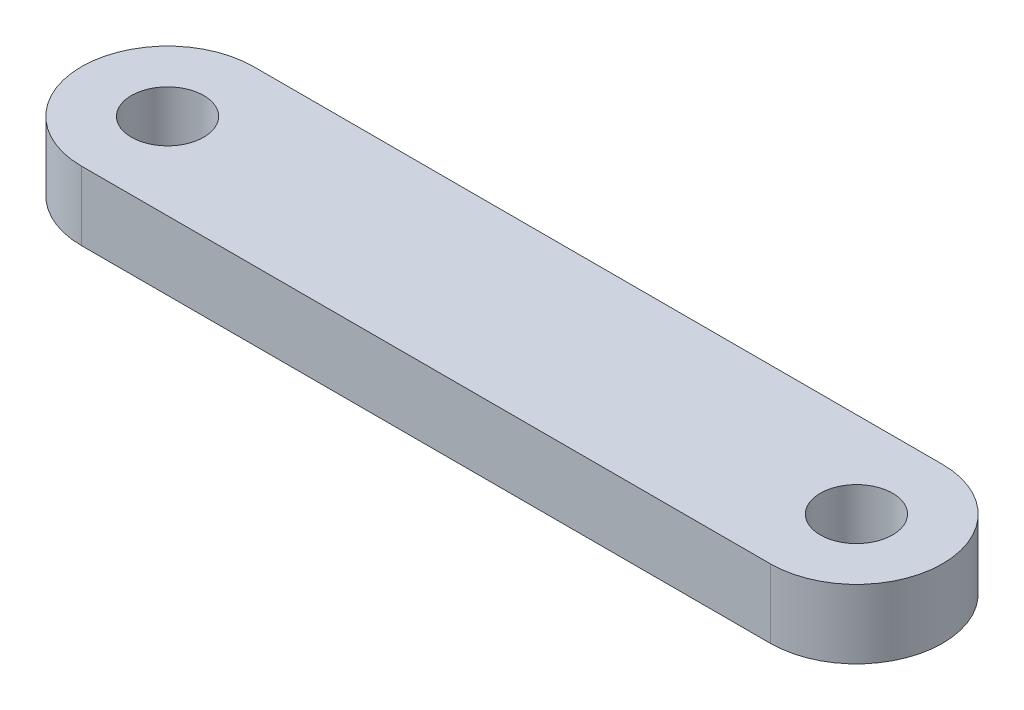
ISO-10303-21;
HEADER;
FILE_DESCRIPTION(('STEP AP214'),'2;1');
FILE_NAME('part.step','',(''),(''),'','','');
FILE_SCHEMA(('AUTOMOTIVE_DESIGN { 1 0 10303 214 1 1 1 1 }'));
ENDSEC;
DATA;
#1=APPLICATION_CONTEXT('core data for automotive mechanical design processes');
#2=APPLICATION_PROTOCOL_DEFINITION('international standard','automotive_design',2000,#1);
#3=PRODUCT_CONTEXT('',#1,'mechanical');
#4=PRODUCT('Part','Part','',(#3));
#5=PRODUCT_RELATED_PRODUCT_CATEGORY('part','',(#4));
#6=PRODUCT_DEFINITION_FORMATION('','',#4);
#7=PRODUCT_DEFINITION_CONTEXT('part definition',#1,'design');
#8=PRODUCT_DEFINITION('design','',#6,#7);
#9=PRODUCT_DEFINITION_SHAPE('','',#8);
#10=(LENGTH_UNIT() NAMED_UNIT(*) SI_UNIT(.MILLI.,.METRE.));
#11=(NAMED_UNIT(*) PLANE_ANGLE_UNIT() SI_UNIT($,.RADIAN.));
#12=(NAMED_UNIT(*) SI_UNIT($,.STERADIAN.) SOLID_ANGLE_UNIT());
#13=UNCERTAINTY_MEASURE_WITH_UNIT(LENGTH_MEASURE(1.E-05),#10,'distance_accuracy_value','');
#14=(GEOMETRIC_REPRESENTATION_CONTEXT(3) GLOBAL_UNCERTAINTY_ASSIGNED_CONTEXT((#13)) GLOBAL_UNIT_ASSIGNED_CONTEXT((#10,
#11,#12)) REPRESENTATION_CONTEXT('',''));
#15=CARTESIAN_POINT('',(0.,0.,0.));
#16=DIRECTION('',(0.,0.,1.));
#17=DIRECTION('',(1.,0.,0.));
#18=AXIS2_PLACEMENT_3D('',#15,#16,#17);
#19=CARTESIAN_POINT('',(0.,2.,0.));
#20=DIRECTION('',(0.,1.,0.));
#21=DIRECTION('',(0.,0.,1.));
#22=AXIS2_PLACEMENT_3D('',#19,#20,#21);
#23=PLANE('',#22);
#24=CARTESIAN_POINT('',(0.,2.,0.));
#25=DIRECTION('',(0.,1.,0.));
#26=DIRECTION('',(0.,0.,1.));
#27=AXIS2_PLACEMENT_3D('',#24,#25,#26);
#28=CIRCLE('',#27,1.05);
#29=CARTESIAN_POINT('',(0.,2.,1.05));
#30=VERTEX_POINT('',#29);
#31=EDGE_CURVE('E104',#30,#30,#28,.T.);
#32=ORIENTED_EDGE('',*,*,#31,.F.);
#33=EDGE_LOOP('',(#32));
#34=FACE_BOUND('',#33,.T.);
#35=CARTESIAN_POINT('',(0.,2.,0.));
#36=DIRECTION('',(0.,1.,0.));
#37=DIRECTION('',(0.,0.,1.));
#38=AXIS2_PLACEMENT_3D('',#35,#36,#37);
#39=CIRCLE('',#38,2.5);
#40=CARTESIAN_POINT('',(0.,2.,-2.5));
#41=VERTEX_POINT('',#40);
#42=CARTESIAN_POINT('',(0.,2.,2.5));
#43=VERTEX_POINT('',#42);
#44=EDGE_CURVE('E89',#41,#43,#39,.T.);
#45=ORIENTED_EDGE('',*,*,#44,.T.);
#46=DIRECTION('',(1.,0.,0.));
#47=VECTOR('',#46,1.);
#48=CARTESIAN_POINT('',(0.,2.,2.5));
#49=LINE('',#48,#47);
#50=CARTESIAN_POINT('',(20.,2.,2.5));
#51=VERTEX_POINT('',#50);
#52=EDGE_CURVE('E84',#43,#51,#49,.T.);
#53=ORIENTED_EDGE('',*,*,#52,.T.);
#54=CARTESIAN_POINT('',(20.,2.,0.));
#55=DIRECTION('',(0.,1.,0.));
#56=DIRECTION('',(0.,0.,1.));
#57=AXIS2_PLACEMENT_3D('',#54,#55,#56);
#58=CIRCLE('',#57,2.5);
#59=CARTESIAN_POINT('',(20.,2.,-2.5));
#60=VERTEX_POINT('',#59);
#61=EDGE_CURVE('E87',#51,#60,#58,.T.);
#62=ORIENTED_EDGE('',*,*,#61,.T.);
#63=DIRECTION('',(-1.,0.,0.));
#64=VECTOR('',#63,1.);
#65=CARTESIAN_POINT('',(0.,2.,-2.5));
#66=LINE('',#65,#64);
#67=EDGE_CURVE('E54',#60,#41,#66,.T.);
#68=ORIENTED_EDGE('',*,*,#67,.T.);
#69=EDGE_LOOP('',(#45,#53,#62,#68));
#70=FACE_BOUND('',#69,.T.);
#71=CARTESIAN_POINT('',(20.,2.,0.));
#72=DIRECTION('',(0.,1.,0.));
#73=DIRECTION('',(0.,0.,1.));
#74=AXIS2_PLACEMENT_3D('',#71,#72,#73);
#75=CIRCLE('',#74,1.05);
#76=CARTESIAN_POINT('',(20.,2.,1.05));
#77=VERTEX_POINT('',#76);
#78=EDGE_CURVE('E119',#77,#77,#75,.T.);
#79=ORIENTED_EDGE('',*,*,#78,.F.);
#80=EDGE_LOOP('',(#79));
#81=FACE_BOUND('',#80,.T.);
#82=ADVANCED_FACE('F37',(#34,#70,#81),#23,.T.);
#83=CARTESIAN_POINT('',(0.,0.,0.));
#84=DIRECTION('',(0.,1.,0.));
#85=DIRECTION('',(0.,0.,1.));
#86=AXIS2_PLACEMENT_3D('',#83,#84,#85);
#87=PLANE('',#86);
#88=CARTESIAN_POINT('',(0.,0.,0.));
#89=DIRECTION('',(0.,1.,0.));
#90=DIRECTION('',(0.,0.,1.));
#91=AXIS2_PLACEMENT_3D('',#88,#89,#90);
#92=CIRCLE('',#91,2.5);
#93=CARTESIAN_POINT('',(0.,0.,-2.5));
#94=VERTEX_POINT('',#93);
#95=CARTESIAN_POINT('',(0.,0.,2.5));
#96=VERTEX_POINT('',#95);
#97=EDGE_CURVE('E101',#94,#96,#92,.T.);
#98=ORIENTED_EDGE('',*,*,#97,.F.);
#99=DIRECTION('',(-1.,0.,0.));
#100=VECTOR('',#99,1.);
#101=CARTESIAN_POINT('',(0.,0.,-2.5));
#102=LINE('',#101,#100);
#103=CARTESIAN_POINT('',(20.,0.,-2.5));
#104=VERTEX_POINT('',#103);
#105=EDGE_CURVE('E77',#104,#94,#102,.T.);
#106=ORIENTED_EDGE('',*,*,#105,.F.);
#107=CARTESIAN_POINT('',(20.,0.,0.));
#108=DIRECTION('',(0.,1.,0.));
#109=DIRECTION('',(0.,0.,1.));
#110=AXIS2_PLACEMENT_3D('',#107,#108,#109);
#111=CIRCLE('',#110,2.5);
#112=CARTESIAN_POINT('',(20.,0.,2.5));
#113=VERTEX_POINT('',#112);
#114=EDGE_CURVE('E71',#113,#104,#111,.T.);
#115=ORIENTED_EDGE('',*,*,#114,.F.);
#116=DIRECTION('',(1.,0.,0.));
#117=VECTOR('',#116,1.);
#118=CARTESIAN_POINT('',(0.,0.,2.5));
#119=LINE('',#118,#117);
#120=EDGE_CURVE('E93',#96,#113,#119,.T.);
#121=ORIENTED_EDGE('',*,*,#120,.F.);
#122=EDGE_LOOP('',(#98,#106,#115,#121));
#123=FACE_BOUND('',#122,.T.);
#124=CARTESIAN_POINT('',(0.,0.,0.));
#125=DIRECTION('',(0.,1.,0.));
#126=DIRECTION('',(0.,0.,1.));
#127=AXIS2_PLACEMENT_3D('',#124,#125,#126);
#128=CIRCLE('',#127,1.05);
#129=CARTESIAN_POINT('',(0.,0.,1.05));
#130=VERTEX_POINT('',#129);
#131=EDGE_CURVE('E116',#130,#130,#128,.T.);
#132=ORIENTED_EDGE('',*,*,#131,.T.);
#133=EDGE_LOOP('',(#132));
#134=FACE_BOUND('',#133,.T.);
#135=CARTESIAN_POINT('',(20.,0.,0.));
#136=DIRECTION('',(0.,1.,0.));
#137=DIRECTION('',(0.,0.,1.));
#138=AXIS2_PLACEMENT_3D('',#135,#136,#137);
#139=CIRCLE('',#138,1.05);
#140=CARTESIAN_POINT('',(20.,0.,1.05));
#141=VERTEX_POINT('',#140);
#142=EDGE_CURVE('E122',#141,#141,#139,.T.);
#143=ORIENTED_EDGE('',*,*,#142,.T.);
#144=EDGE_LOOP('',(#143));
#145=FACE_BOUND('',#144,.T.);
#146=ADVANCED_FACE('F112',(#123,#134,#145),#87,.F.);
#147=CARTESIAN_POINT('',(0.,2.,0.));
#148=DIRECTION('',(0.,-1.,0.));
#149=DIRECTION('',(0.,0.,-1.));
#150=AXIS2_PLACEMENT_3D('',#147,#148,#149);
#151=CYLINDRICAL_SURFACE('',#150,2.5);
#152=ORIENTED_EDGE('',*,*,#97,.T.);
#153=DIRECTION('',(0.,-1.,0.));
#154=VECTOR('',#153,1.);
#155=CARTESIAN_POINT('',(0.,2.,2.5));
#156=LINE('',#155,#154);
#157=EDGE_CURVE('E11',#43,#96,#156,.T.);
#158=ORIENTED_EDGE('',*,*,#157,.F.);
#159=ORIENTED_EDGE('',*,*,#44,.F.);
#160=DIRECTION('',(0.,-1.,0.));
#161=VECTOR('',#160,1.);
#162=CARTESIAN_POINT('',(0.,2.,-2.5));
#163=LINE('',#162,#161);
#164=EDGE_CURVE('E97',#41,#94,#163,.T.);
#165=ORIENTED_EDGE('',*,*,#164,.T.);
#166=EDGE_LOOP('',(#152,#158,#159,#165));
#167=FACE_BOUND('',#166,.T.);
#168=ADVANCED_FACE('F39',(#167),#151,.T.);
#169=CARTESIAN_POINT('',(0.,2.,2.5));
#170=DIRECTION('',(0.,0.,-1.));
#171=DIRECTION('',(-1.,0.,0.));
#172=AXIS2_PLACEMENT_3D('',#169,#170,#171);
#173=PLANE('',#172);
#174=ORIENTED_EDGE('',*,*,#120,.T.);
#175=DIRECTION('',(0.,-1.,0.));
#176=VECTOR('',#175,1.);
#177=CARTESIAN_POINT('',(20.,2.,2.5));
#178=LINE('',#177,#176);
#179=EDGE_CURVE('E46',#51,#113,#178,.T.);
#180=ORIENTED_EDGE('',*,*,#179,.F.);
#181=ORIENTED_EDGE('',*,*,#52,.F.);
#182=ORIENTED_EDGE('',*,*,#157,.T.);
#183=EDGE_LOOP('',(#174,#180,#181,#182));
#184=FACE_BOUND('',#183,.T.);
#185=ADVANCED_FACE('F92',(#184),#173,.F.);
#186=CARTESIAN_POINT('',(20.,2.,0.));
#187=DIRECTION('',(0.,-1.,0.));
#188=DIRECTION('',(0.,0.,-1.));
#189=AXIS2_PLACEMENT_3D('',#186,#187,#188);
#190=CYLINDRICAL_SURFACE('',#189,2.5);
#191=ORIENTED_EDGE('',*,*,#114,.T.);
#192=DIRECTION('',(0.,-1.,0.));
#193=VECTOR('',#192,1.);
#194=CARTESIAN_POINT('',(20.,2.,-2.5));
#195=LINE('',#194,#193);
#196=EDGE_CURVE('E94',#60,#104,#195,.T.);
#197=ORIENTED_EDGE('',*,*,#196,.F.);
#198=ORIENTED_EDGE('',*,*,#61,.F.);
#199=ORIENTED_EDGE('',*,*,#179,.T.);
#200=EDGE_LOOP('',(#191,#197,#198,#199));
#201=FACE_BOUND('',#200,.T.);
#202=ADVANCED_FACE('F95',(#201),#190,.T.);
#203=CARTESIAN_POINT('',(0.,2.,-2.5));
#204=DIRECTION('',(0.,0.,1.));
#205=DIRECTION('',(1.,0.,0.));
#206=AXIS2_PLACEMENT_3D('',#203,#204,#205);
#207=PLANE('',#206);
#208=ORIENTED_EDGE('',*,*,#105,.T.);
#209=ORIENTED_EDGE('',*,*,#164,.F.);
#210=ORIENTED_EDGE('',*,*,#67,.F.);
#211=ORIENTED_EDGE('',*,*,#196,.T.);
#212=EDGE_LOOP('',(#208,#209,#210,#211));
#213=FACE_BOUND('',#212,.T.);
#214=ADVANCED_FACE('F109',(#213),#207,.F.);
#215=CARTESIAN_POINT('',(0.,2.,0.));
#216=DIRECTION('',(0.,-1.,0.));
#217=DIRECTION('',(0.,0.,-1.));
#218=AXIS2_PLACEMENT_3D('',#215,#216,#217);
#219=CYLINDRICAL_SURFACE('',#218,1.05);
#220=ORIENTED_EDGE('',*,*,#31,.T.);
#221=EDGE_LOOP('',(#220));
#222=FACE_BOUND('',#221,.T.);
#223=ORIENTED_EDGE('',*,*,#131,.F.);
#224=EDGE_LOOP('',(#223));
#225=FACE_BOUND('',#224,.T.);
#226=ADVANCED_FACE('F139',(#222,#225),#219,.F.);
#227=CARTESIAN_POINT('',(20.,2.,0.));
#228=DIRECTION('',(0.,-1.,0.));
#229=DIRECTION('',(0.,0.,-1.));
#230=AXIS2_PLACEMENT_3D('',#227,#228,#229);
#231=CYLINDRICAL_SURFACE('',#230,1.05);
#232=ORIENTED_EDGE('',*,*,#78,.T.);
#233=EDGE_LOOP('',(#232));
#234=FACE_BOUND('',#233,.T.);
#235=ORIENTED_EDGE('',*,*,#142,.F.);
#236=EDGE_LOOP('',(#235));
#237=FACE_BOUND('',#236,.T.);
#238=ADVANCED_FACE('F128',(#234,#237),#231,.F.);
#239=CLOSED_SHELL('',(#82,#146,#168,#185,#202,#214,#226,#238));
#240=MANIFOLD_SOLID_BREP('B2',#239);
#241=ADVANCED_BREP_SHAPE_REPRESENTATION('',(#18,#240),#14);
#242=SHAPE_DEFINITION_REPRESENTATION(#9,#241);
ENDSEC;
END-ISO-10303-21;
